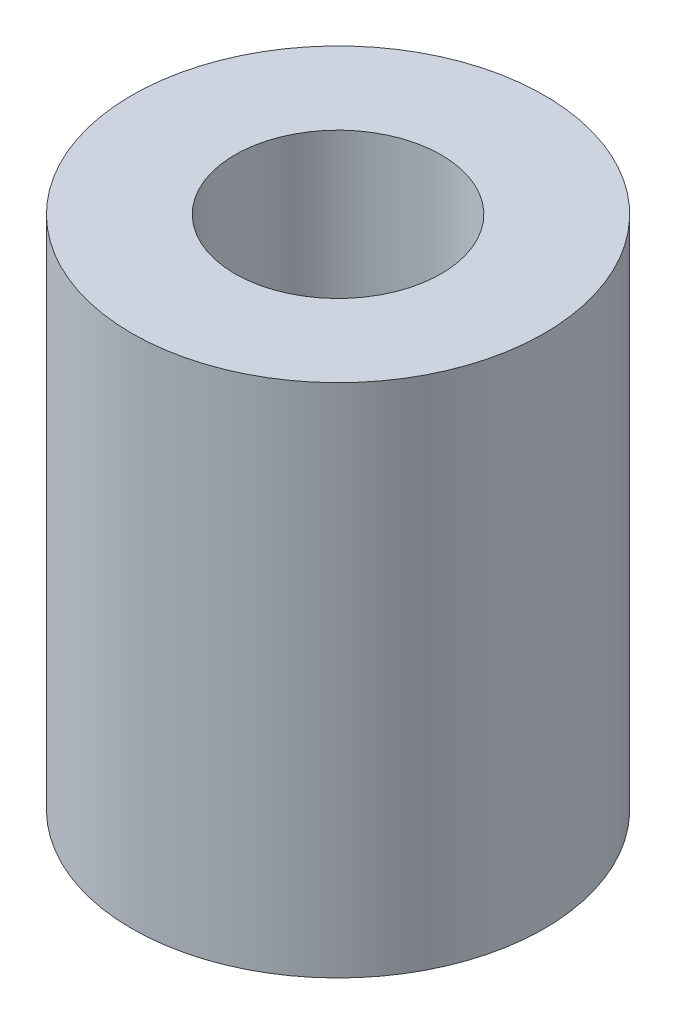
ISO-10303-21;
HEADER;
FILE_DESCRIPTION(('STEP AP214'),'2;1');
FILE_NAME('part.step','',(''),(''),'','','');
FILE_SCHEMA(('AUTOMOTIVE_DESIGN { 1 0 10303 214 1 1 1 1 }'));
ENDSEC;
DATA;
#1=APPLICATION_CONTEXT('core data for automotive mechanical design processes');
#2=APPLICATION_PROTOCOL_DEFINITION('international standard','automotive_design',2000,#1);
#3=PRODUCT_CONTEXT('',#1,'mechanical');
#4=PRODUCT('Part','Part','',(#3));
#5=PRODUCT_RELATED_PRODUCT_CATEGORY('part','',(#4));
#6=PRODUCT_DEFINITION_FORMATION('','',#4);
#7=PRODUCT_DEFINITION_CONTEXT('part definition',#1,'design');
#8=PRODUCT_DEFINITION('design','',#6,#7);
#9=PRODUCT_DEFINITION_SHAPE('','',#8);
#10=(LENGTH_UNIT() NAMED_UNIT(*) SI_UNIT(.MILLI.,.METRE.));
#11=(NAMED_UNIT(*) PLANE_ANGLE_UNIT() SI_UNIT($,.RADIAN.));
#12=(NAMED_UNIT(*) SI_UNIT($,.STERADIAN.) SOLID_ANGLE_UNIT());
#13=UNCERTAINTY_MEASURE_WITH_UNIT(LENGTH_MEASURE(1.E-05),#10,'distance_accuracy_value','');
#14=(GEOMETRIC_REPRESENTATION_CONTEXT(3) GLOBAL_UNCERTAINTY_ASSIGNED_CONTEXT((#13)) GLOBAL_UNIT_ASSIGNED_CONTEXT((#10,
#11,#12)) REPRESENTATION_CONTEXT('',''));
#15=CARTESIAN_POINT('',(0.,0.,0.));
#16=DIRECTION('',(0.,0.,1.));
#17=DIRECTION('',(1.,0.,0.));
#18=AXIS2_PLACEMENT_3D('',#15,#16,#17);
#19=CARTESIAN_POINT('',(0.,2.5,0.));
#20=DIRECTION('',(0.,1.,0.));
#21=DIRECTION('',(0.,0.,1.));
#22=AXIS2_PLACEMENT_3D('',#19,#20,#21);
#23=PLANE('',#22);
#24=CARTESIAN_POINT('',(0.,2.5,0.));
#25=DIRECTION('',(0.,1.,0.));
#26=DIRECTION('',(0.,0.,1.));
#27=AXIS2_PLACEMENT_3D('',#24,#25,#26);
#28=CIRCLE('',#27,2.);
#29=CARTESIAN_POINT('',(0.,2.5,2.));
#30=VERTEX_POINT('',#29);
#31=EDGE_CURVE('E10',#30,#30,#28,.T.);
#32=ORIENTED_EDGE('',*,*,#31,.T.);
#33=EDGE_LOOP('',(#32));
#34=FACE_BOUND('',#33,.T.);
#35=CARTESIAN_POINT('',(0.,2.5,0.));
#36=DIRECTION('',(0.,1.,0.));
#37=DIRECTION('',(0.,0.,1.));
#38=AXIS2_PLACEMENT_3D('',#35,#36,#37);
#39=CIRCLE('',#38,1.);
#40=CARTESIAN_POINT('',(0.,2.5,1.));
#41=VERTEX_POINT('',#40);
#42=EDGE_CURVE('E46',#41,#41,#39,.T.);
#43=ORIENTED_EDGE('',*,*,#42,.F.);
#44=EDGE_LOOP('',(#43));
#45=FACE_BOUND('',#44,.T.);
#46=ADVANCED_FACE('F35',(#34,#45),#23,.T.);
#47=CARTESIAN_POINT('',(0.,-2.5,0.));
#48=DIRECTION('',(0.,1.,0.));
#49=DIRECTION('',(0.,0.,1.));
#50=AXIS2_PLACEMENT_3D('',#47,#48,#49);
#51=PLANE('',#50);
#52=CARTESIAN_POINT('',(0.,-2.5,0.));
#53=DIRECTION('',(0.,1.,0.));
#54=DIRECTION('',(0.,0.,1.));
#55=AXIS2_PLACEMENT_3D('',#52,#53,#54);
#56=CIRCLE('',#55,2.);
#57=CARTESIAN_POINT('',(0.,-2.5,2.));
#58=VERTEX_POINT('',#57);
#59=EDGE_CURVE('E39',#58,#58,#56,.T.);
#60=ORIENTED_EDGE('',*,*,#59,.F.);
#61=EDGE_LOOP('',(#60));
#62=FACE_BOUND('',#61,.T.);
#63=CARTESIAN_POINT('',(0.,-2.5,0.));
#64=DIRECTION('',(0.,1.,0.));
#65=DIRECTION('',(0.,0.,1.));
#66=AXIS2_PLACEMENT_3D('',#63,#64,#65);
#67=CIRCLE('',#66,1.);
#68=CARTESIAN_POINT('',(0.,-2.5,1.));
#69=VERTEX_POINT('',#68);
#70=EDGE_CURVE('E48',#69,#69,#67,.T.);
#71=ORIENTED_EDGE('',*,*,#70,.T.);
#72=EDGE_LOOP('',(#71));
#73=FACE_BOUND('',#72,.T.);
#74=ADVANCED_FACE('F58',(#62,#73),#51,.F.);
#75=CARTESIAN_POINT('',(0.,2.5,0.));
#76=DIRECTION('',(0.,-1.,0.));
#77=DIRECTION('',(0.,0.,-1.));
#78=AXIS2_PLACEMENT_3D('',#75,#76,#77);
#79=CYLINDRICAL_SURFACE('',#78,2.);
#80=ORIENTED_EDGE('',*,*,#31,.F.);
#81=EDGE_LOOP('',(#80));
#82=FACE_BOUND('',#81,.T.);
#83=ORIENTED_EDGE('',*,*,#59,.T.);
#84=EDGE_LOOP('',(#83));
#85=FACE_BOUND('',#84,.T.);
#86=ADVANCED_FACE('F37',(#82,#85),#79,.T.);
#87=CARTESIAN_POINT('',(0.,2.5,0.));
#88=DIRECTION('',(0.,-1.,0.));
#89=DIRECTION('',(0.,0.,-1.));
#90=AXIS2_PLACEMENT_3D('',#87,#88,#89);
#91=CYLINDRICAL_SURFACE('',#90,1.);
#92=ORIENTED_EDGE('',*,*,#42,.T.);
#93=EDGE_LOOP('',(#92));
#94=FACE_BOUND('',#93,.T.);
#95=ORIENTED_EDGE('',*,*,#70,.F.);
#96=EDGE_LOOP('',(#95));
#97=FACE_BOUND('',#96,.T.);
#98=ADVANCED_FACE('F54',(#94,#97),#91,.F.);
#99=CLOSED_SHELL('',(#46,#74,#86,#98));
#100=MANIFOLD_SOLID_BREP('B2',#99);
#101=ADVANCED_BREP_SHAPE_REPRESENTATION('',(#18,#100),#14);
#102=SHAPE_DEFINITION_REPRESENTATION(#9,#101);
ENDSEC;
END-ISO-10303-21;
